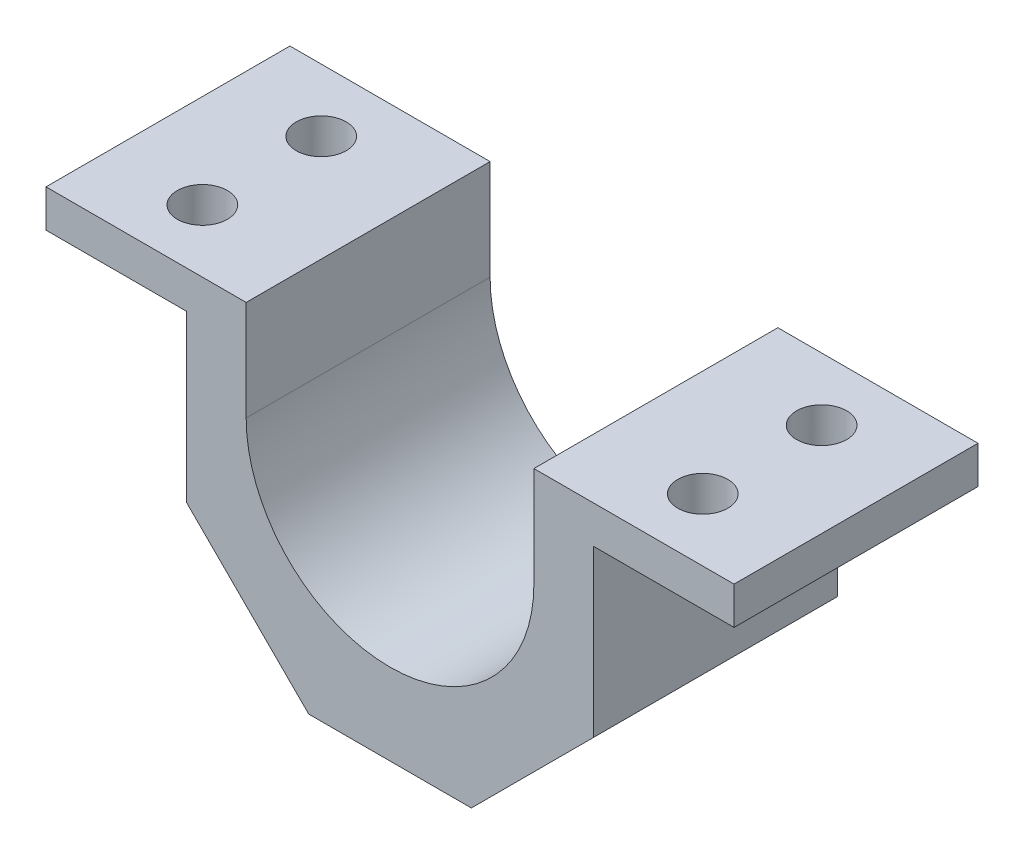
ISO-10303-21;
HEADER;
FILE_DESCRIPTION(('STEP AP214'),'2;1');
FILE_NAME('part.step','',(''),(''),'','','');
FILE_SCHEMA(('AUTOMOTIVE_DESIGN { 1 0 10303 214 1 1 1 1 }'));
ENDSEC;
DATA;
#1=APPLICATION_CONTEXT('core data for automotive mechanical design processes');
#2=APPLICATION_PROTOCOL_DEFINITION('international standard','automotive_design',2000,#1);
#3=PRODUCT_CONTEXT('',#1,'mechanical');
#4=PRODUCT('Part','Part','',(#3));
#5=PRODUCT_RELATED_PRODUCT_CATEGORY('part','',(#4));
#6=PRODUCT_DEFINITION_FORMATION('','',#4);
#7=PRODUCT_DEFINITION_CONTEXT('part definition',#1,'design');
#8=PRODUCT_DEFINITION('design','',#6,#7);
#9=PRODUCT_DEFINITION_SHAPE('','',#8);
#10=(LENGTH_UNIT() NAMED_UNIT(*) SI_UNIT(.MILLI.,.METRE.));
#11=(NAMED_UNIT(*) PLANE_ANGLE_UNIT() SI_UNIT($,.RADIAN.));
#12=(NAMED_UNIT(*) SI_UNIT($,.STERADIAN.) SOLID_ANGLE_UNIT());
#13=UNCERTAINTY_MEASURE_WITH_UNIT(LENGTH_MEASURE(1.E-05),#10,'distance_accuracy_value','');
#14=(GEOMETRIC_REPRESENTATION_CONTEXT(3) GLOBAL_UNCERTAINTY_ASSIGNED_CONTEXT((#13)) GLOBAL_UNIT_ASSIGNED_CONTEXT((#10,
#11,#12)) REPRESENTATION_CONTEXT('',''));
#15=CARTESIAN_POINT('',(0.,0.,0.));
#16=DIRECTION('',(0.,0.,1.));
#17=DIRECTION('',(1.,0.,0.));
#18=AXIS2_PLACEMENT_3D('',#15,#16,#17);
#19=CARTESIAN_POINT('',(0.,0.,19.5));
#20=DIRECTION('',(0.,0.,-1.));
#21=DIRECTION('',(-1.,0.,0.));
#22=AXIS2_PLACEMENT_3D('',#19,#20,#21);
#23=CYLINDRICAL_SURFACE('',#22,23.);
#24=CARTESIAN_POINT('',(0.,0.,-19.5));
#25=DIRECTION('',(0.,0.,-1.));
#26=DIRECTION('',(1.,0.,0.));
#27=AXIS2_PLACEMENT_3D('',#24,#25,#26);
#28=CIRCLE('',#27,23.);
#29=CARTESIAN_POINT('',(23.,0.,-19.5));
#30=VERTEX_POINT('',#29);
#31=CARTESIAN_POINT('',(-23.,0.,-19.5));
#32=VERTEX_POINT('',#31);
#33=EDGE_CURVE('E172',#30,#32,#28,.T.);
#34=ORIENTED_EDGE('',*,*,#33,.T.);
#35=DIRECTION('',(0.,0.,-1.));
#36=VECTOR('',#35,1.);
#37=CARTESIAN_POINT('',(-23.,0.,19.5));
#38=LINE('',#37,#36);
#39=CARTESIAN_POINT('',(-23.,0.,19.5));
#40=VERTEX_POINT('',#39);
#41=EDGE_CURVE('E11',#40,#32,#38,.T.);
#42=ORIENTED_EDGE('',*,*,#41,.F.);
#43=CARTESIAN_POINT('',(0.,0.,19.5));
#44=DIRECTION('',(0.,0.,-1.));
#45=DIRECTION('',(1.,0.,0.));
#46=AXIS2_PLACEMENT_3D('',#43,#44,#45);
#47=CIRCLE('',#46,23.);
#48=CARTESIAN_POINT('',(23.,0.,19.5));
#49=VERTEX_POINT('',#48);
#50=EDGE_CURVE('E202',#49,#40,#47,.T.);
#51=ORIENTED_EDGE('',*,*,#50,.F.);
#52=DIRECTION('',(0.,0.,-1.));
#53=VECTOR('',#52,1.);
#54=CARTESIAN_POINT('',(23.,0.,19.5));
#55=LINE('',#54,#53);
#56=EDGE_CURVE('E173',#49,#30,#55,.T.);
#57=ORIENTED_EDGE('',*,*,#56,.T.);
#58=EDGE_LOOP('',(#34,#42,#51,#57));
#59=FACE_BOUND('',#58,.T.);
#60=ADVANCED_FACE('F41',(#59),#23,.F.);
#61=CARTESIAN_POINT('',(-23.,0.,19.5));
#62=DIRECTION('',(-1.,0.,0.));
#63=DIRECTION('',(0.,0.,1.));
#64=AXIS2_PLACEMENT_3D('',#61,#62,#63);
#65=PLANE('',#64);
#66=DIRECTION('',(0.,1.,0.));
#67=VECTOR('',#66,1.);
#68=CARTESIAN_POINT('',(-23.,0.,-19.5));
#69=LINE('',#68,#67);
#70=CARTESIAN_POINT('',(-23.,16.,-19.5));
#71=VERTEX_POINT('',#70);
#72=EDGE_CURVE('E178',#32,#71,#69,.T.);
#73=ORIENTED_EDGE('',*,*,#72,.T.);
#74=DIRECTION('',(0.,0.,-1.));
#75=VECTOR('',#74,1.);
#76=CARTESIAN_POINT('',(-23.,16.,19.5));
#77=LINE('',#76,#75);
#78=CARTESIAN_POINT('',(-23.,16.,19.5));
#79=VERTEX_POINT('',#78);
#80=EDGE_CURVE('E49',#79,#71,#77,.T.);
#81=ORIENTED_EDGE('',*,*,#80,.F.);
#82=DIRECTION('',(0.,1.,0.));
#83=VECTOR('',#82,1.);
#84=CARTESIAN_POINT('',(-23.,0.,19.5));
#85=LINE('',#84,#83);
#86=EDGE_CURVE('E116',#40,#79,#85,.T.);
#87=ORIENTED_EDGE('',*,*,#86,.F.);
#88=ORIENTED_EDGE('',*,*,#41,.T.);
#89=EDGE_LOOP('',(#73,#81,#87,#88));
#90=FACE_BOUND('',#89,.T.);
#91=ADVANCED_FACE('F291',(#90),#65,.F.);
#92=CARTESIAN_POINT('',(-23.,16.,19.5));
#93=DIRECTION('',(0.,-1.,0.));
#94=DIRECTION('',(0.,0.,-1.));
#95=AXIS2_PLACEMENT_3D('',#92,#93,#94);
#96=PLANE('',#95);
#97=CARTESIAN_POINT('',(-40.,16.,-9.5));
#98=DIRECTION('',(0.,1.,0.));
#99=DIRECTION('',(0.,0.,-1.));
#100=AXIS2_PLACEMENT_3D('',#97,#98,#99);
#101=CIRCLE('',#100,4.00000000000001);
#102=CARTESIAN_POINT('',(-40.,16.,-13.5));
#103=VERTEX_POINT('',#102);
#104=EDGE_CURVE('E460',#103,#103,#101,.T.);
#105=ORIENTED_EDGE('',*,*,#104,.F.);
#106=EDGE_LOOP('',(#105));
#107=FACE_BOUND('',#106,.T.);
#108=CARTESIAN_POINT('',(-40.,16.,9.5));
#109=DIRECTION('',(0.,1.,0.));
#110=DIRECTION('',(0.,0.,1.));
#111=AXIS2_PLACEMENT_3D('',#108,#109,#110);
#112=CIRCLE('',#111,4.00000000000001);
#113=CARTESIAN_POINT('',(-40.,16.,13.5));
#114=VERTEX_POINT('',#113);
#115=EDGE_CURVE('E245',#114,#114,#112,.T.);
#116=ORIENTED_EDGE('',*,*,#115,.F.);
#117=EDGE_LOOP('',(#116));
#118=FACE_BOUND('',#117,.T.);
#119=DIRECTION('',(-1.,0.,0.));
#120=VECTOR('',#119,1.);
#121=CARTESIAN_POINT('',(-23.,16.,-19.5));
#122=LINE('',#121,#120);
#123=CARTESIAN_POINT('',(-55.,16.,-19.5));
#124=VERTEX_POINT('',#123);
#125=EDGE_CURVE('E179',#71,#124,#122,.T.);
#126=ORIENTED_EDGE('',*,*,#125,.T.);
#127=DIRECTION('',(0.,0.,-1.));
#128=VECTOR('',#127,1.);
#129=CARTESIAN_POINT('',(-55.,16.,19.5));
#130=LINE('',#129,#128);
#131=CARTESIAN_POINT('',(-55.,16.,19.5));
#132=VERTEX_POINT('',#131);
#133=EDGE_CURVE('E226',#132,#124,#130,.T.);
#134=ORIENTED_EDGE('',*,*,#133,.F.);
#135=DIRECTION('',(-1.,0.,0.));
#136=VECTOR('',#135,1.);
#137=CARTESIAN_POINT('',(-23.,16.,19.5));
#138=LINE('',#137,#136);
#139=EDGE_CURVE('E246',#79,#132,#138,.T.);
#140=ORIENTED_EDGE('',*,*,#139,.F.);
#141=ORIENTED_EDGE('',*,*,#80,.T.);
#142=EDGE_LOOP('',(#126,#134,#140,#141));
#143=FACE_BOUND('',#142,.T.);
#144=ADVANCED_FACE('F300',(#107,#118,#143),#96,.F.);
#145=CARTESIAN_POINT('',(-55.,16.,19.5));
#146=DIRECTION('',(1.,0.,0.));
#147=DIRECTION('',(0.,1.,0.));
#148=AXIS2_PLACEMENT_3D('',#145,#146,#147);
#149=PLANE('',#148);
#150=DIRECTION('',(0.,-1.,0.));
#151=VECTOR('',#150,1.);
#152=CARTESIAN_POINT('',(-55.,16.,-19.5));
#153=LINE('',#152,#151);
#154=CARTESIAN_POINT('',(-55.,10.,-19.5));
#155=VERTEX_POINT('',#154);
#156=EDGE_CURVE('E185',#124,#155,#153,.T.);
#157=ORIENTED_EDGE('',*,*,#156,.T.);
#158=DIRECTION('',(0.,0.,-1.));
#159=VECTOR('',#158,1.);
#160=CARTESIAN_POINT('',(-55.,10.,19.5));
#161=LINE('',#160,#159);
#162=CARTESIAN_POINT('',(-55.,10.,19.5));
#163=VERTEX_POINT('',#162);
#164=EDGE_CURVE('E223',#163,#155,#161,.T.);
#165=ORIENTED_EDGE('',*,*,#164,.F.);
#166=DIRECTION('',(0.,-1.,0.));
#167=VECTOR('',#166,1.);
#168=CARTESIAN_POINT('',(-55.,16.,19.5));
#169=LINE('',#168,#167);
#170=EDGE_CURVE('E248',#132,#163,#169,.T.);
#171=ORIENTED_EDGE('',*,*,#170,.F.);
#172=ORIENTED_EDGE('',*,*,#133,.T.);
#173=EDGE_LOOP('',(#157,#165,#171,#172));
#174=FACE_BOUND('',#173,.T.);
#175=ADVANCED_FACE('F302',(#174),#149,.F.);
#176=CARTESIAN_POINT('',(-55.,10.,19.5));
#177=DIRECTION('',(0.,1.,0.));
#178=DIRECTION('',(-1.,0.,0.));
#179=AXIS2_PLACEMENT_3D('',#176,#177,#178);
#180=PLANE('',#179);
#181=CARTESIAN_POINT('',(-40.,9.99999999999999,-9.5));
#182=DIRECTION('',(0.,1.,0.));
#183=DIRECTION('',(-1.,0.,0.));
#184=AXIS2_PLACEMENT_3D('',#181,#182,#183);
#185=CIRCLE('',#184,4.00000000000001);
#186=CARTESIAN_POINT('',(-44.,10.,-9.5));
#187=VERTEX_POINT('',#186);
#188=EDGE_CURVE('E42',#187,#187,#185,.T.);
#189=ORIENTED_EDGE('',*,*,#188,.T.);
#190=EDGE_LOOP('',(#189));
#191=FACE_BOUND('',#190,.T.);
#192=CARTESIAN_POINT('',(-40.,9.99999999999999,9.5));
#193=DIRECTION('',(0.,1.,0.));
#194=DIRECTION('',(-1.,0.,0.));
#195=AXIS2_PLACEMENT_3D('',#192,#193,#194);
#196=CIRCLE('',#195,4.00000000000001);
#197=CARTESIAN_POINT('',(-44.,10.,9.5));
#198=VERTEX_POINT('',#197);
#199=EDGE_CURVE('E229',#198,#198,#196,.T.);
#200=ORIENTED_EDGE('',*,*,#199,.T.);
#201=EDGE_LOOP('',(#200));
#202=FACE_BOUND('',#201,.T.);
#203=DIRECTION('',(1.,0.,0.));
#204=VECTOR('',#203,1.);
#205=CARTESIAN_POINT('',(-55.,10.,-19.5));
#206=LINE('',#205,#204);
#207=CARTESIAN_POINT('',(-32.5,9.99999999999999,-19.5));
#208=VERTEX_POINT('',#207);
#209=EDGE_CURVE('E182',#155,#208,#206,.T.);
#210=ORIENTED_EDGE('',*,*,#209,.T.);
#211=DIRECTION('',(0.,0.,-1.));
#212=VECTOR('',#211,1.);
#213=CARTESIAN_POINT('',(-32.5,9.99999999999999,19.5));
#214=LINE('',#213,#212);
#215=CARTESIAN_POINT('',(-32.5,9.99999999999999,19.5));
#216=VERTEX_POINT('',#215);
#217=EDGE_CURVE('E217',#216,#208,#214,.T.);
#218=ORIENTED_EDGE('',*,*,#217,.F.);
#219=DIRECTION('',(1.,0.,0.));
#220=VECTOR('',#219,1.);
#221=CARTESIAN_POINT('',(-55.,10.,19.5));
#222=LINE('',#221,#220);
#223=EDGE_CURVE('E255',#163,#216,#222,.T.);
#224=ORIENTED_EDGE('',*,*,#223,.F.);
#225=ORIENTED_EDGE('',*,*,#164,.T.);
#226=EDGE_LOOP('',(#210,#218,#224,#225));
#227=FACE_BOUND('',#226,.T.);
#228=ADVANCED_FACE('F310',(#191,#202,#227),#180,.F.);
#229=CARTESIAN_POINT('',(-32.5,9.99999999999999,19.5));
#230=DIRECTION('',(1.,0.,0.));
#231=DIRECTION('',(0.,1.,0.));
#232=AXIS2_PLACEMENT_3D('',#229,#230,#231);
#233=PLANE('',#232);
#234=DIRECTION('',(0.,-1.,0.));
#235=VECTOR('',#234,1.);
#236=CARTESIAN_POINT('',(-32.5,9.99999999999999,-19.5));
#237=LINE('',#236,#235);
#238=CARTESIAN_POINT('',(-32.5,-16.499999999999,-19.5));
#239=VERTEX_POINT('',#238);
#240=EDGE_CURVE('E186',#208,#239,#237,.T.);
#241=ORIENTED_EDGE('',*,*,#240,.T.);
#242=DIRECTION('',(0.,0.,-1.));
#243=VECTOR('',#242,1.);
#244=CARTESIAN_POINT('',(-32.5,-16.499999999999,19.5));
#245=LINE('',#244,#243);
#246=CARTESIAN_POINT('',(-32.5,-16.499999999999,19.5));
#247=VERTEX_POINT('',#246);
#248=EDGE_CURVE('E220',#247,#239,#245,.T.);
#249=ORIENTED_EDGE('',*,*,#248,.F.);
#250=DIRECTION('',(0.,-1.,0.));
#251=VECTOR('',#250,1.);
#252=CARTESIAN_POINT('',(-32.5,9.99999999999999,19.5));
#253=LINE('',#252,#251);
#254=EDGE_CURVE('E254',#216,#247,#253,.T.);
#255=ORIENTED_EDGE('',*,*,#254,.F.);
#256=ORIENTED_EDGE('',*,*,#217,.T.);
#257=EDGE_LOOP('',(#241,#249,#255,#256));
#258=FACE_BOUND('',#257,.T.);
#259=ADVANCED_FACE('F311',(#258),#233,.F.);
#260=CARTESIAN_POINT('',(-32.5,-16.499999999999,19.5));
#261=DIRECTION('',(0.707106781186565,0.70710678118653,0.));
#262=DIRECTION('',(-0.70710678118653,0.707106781186565,0.));
#263=AXIS2_PLACEMENT_3D('',#260,#261,#262);
#264=PLANE('',#263);
#265=DIRECTION('',(0.70710678118653,-0.707106781186565,0.));
#266=VECTOR('',#265,1.);
#267=CARTESIAN_POINT('',(-32.5,-16.499999999999,-19.5));
#268=LINE('',#267,#266);
#269=CARTESIAN_POINT('',(-13.,-36.,-19.5));
#270=VERTEX_POINT('',#269);
#271=EDGE_CURVE('E187',#239,#270,#268,.T.);
#272=ORIENTED_EDGE('',*,*,#271,.T.);
#273=DIRECTION('',(0.,0.,-1.));
#274=VECTOR('',#273,1.);
#275=CARTESIAN_POINT('',(-13.,-36.,19.5));
#276=LINE('',#275,#274);
#277=CARTESIAN_POINT('',(-13.,-36.,19.5));
#278=VERTEX_POINT('',#277);
#279=EDGE_CURVE('E215',#278,#270,#276,.T.);
#280=ORIENTED_EDGE('',*,*,#279,.F.);
#281=DIRECTION('',(0.70710678118653,-0.707106781186565,0.));
#282=VECTOR('',#281,1.);
#283=CARTESIAN_POINT('',(-32.5,-16.499999999999,19.5));
#284=LINE('',#283,#282);
#285=EDGE_CURVE('E258',#247,#278,#284,.T.);
#286=ORIENTED_EDGE('',*,*,#285,.F.);
#287=ORIENTED_EDGE('',*,*,#248,.T.);
#288=EDGE_LOOP('',(#272,#280,#286,#287));
#289=FACE_BOUND('',#288,.T.);
#290=ADVANCED_FACE('F314',(#289),#264,.F.);
#291=CARTESIAN_POINT('',(13.,-36.,19.5));
#292=DIRECTION('',(0.,1.,0.));
#293=DIRECTION('',(-1.,0.,0.));
#294=AXIS2_PLACEMENT_3D('',#291,#292,#293);
#295=PLANE('',#294);
#296=DIRECTION('',(1.,0.,0.));
#297=VECTOR('',#296,1.);
#298=CARTESIAN_POINT('',(13.,-36.,-19.5));
#299=LINE('',#298,#297);
#300=CARTESIAN_POINT('',(13.,-36.,-19.5));
#301=VERTEX_POINT('',#300);
#302=EDGE_CURVE('E189',#270,#301,#299,.T.);
#303=ORIENTED_EDGE('',*,*,#302,.T.);
#304=DIRECTION('',(0.,0.,-1.));
#305=VECTOR('',#304,1.);
#306=CARTESIAN_POINT('',(13.,-36.,19.5));
#307=LINE('',#306,#305);
#308=CARTESIAN_POINT('',(13.,-36.,19.5));
#309=VERTEX_POINT('',#308);
#310=EDGE_CURVE('E213',#309,#301,#307,.T.);
#311=ORIENTED_EDGE('',*,*,#310,.F.);
#312=DIRECTION('',(1.,0.,0.));
#313=VECTOR('',#312,1.);
#314=CARTESIAN_POINT('',(13.,-36.,19.5));
#315=LINE('',#314,#313);
#316=EDGE_CURVE('E256',#278,#309,#315,.T.);
#317=ORIENTED_EDGE('',*,*,#316,.F.);
#318=ORIENTED_EDGE('',*,*,#279,.T.);
#319=EDGE_LOOP('',(#303,#311,#317,#318));
#320=FACE_BOUND('',#319,.T.);
#321=ADVANCED_FACE('F317',(#320),#295,.F.);
#322=CARTESIAN_POINT('',(32.5,-16.499999999999,19.5));
#323=DIRECTION('',(-0.707106781186566,0.70710678118653,0.));
#324=DIRECTION('',(-0.70710678118653,-0.707106781186565,0.));
#325=AXIS2_PLACEMENT_3D('',#322,#323,#324);
#326=PLANE('',#325);
#327=DIRECTION('',(0.70710678118653,0.707106781186566,0.));
#328=VECTOR('',#327,1.);
#329=CARTESIAN_POINT('',(32.5,-16.499999999999,-19.5));
#330=LINE('',#329,#328);
#331=CARTESIAN_POINT('',(32.5,-16.499999999999,-19.5));
#332=VERTEX_POINT('',#331);
#333=EDGE_CURVE('E195',#301,#332,#330,.T.);
#334=ORIENTED_EDGE('',*,*,#333,.T.);
#335=DIRECTION('',(0.,0.,-1.));
#336=VECTOR('',#335,1.);
#337=CARTESIAN_POINT('',(32.5,-16.499999999999,19.5));
#338=LINE('',#337,#336);
#339=CARTESIAN_POINT('',(32.5,-16.499999999999,19.5));
#340=VERTEX_POINT('',#339);
#341=EDGE_CURVE('E208',#340,#332,#338,.T.);
#342=ORIENTED_EDGE('',*,*,#341,.F.);
#343=DIRECTION('',(0.70710678118653,0.707106781186566,0.));
#344=VECTOR('',#343,1.);
#345=CARTESIAN_POINT('',(32.5,-16.499999999999,19.5));
#346=LINE('',#345,#344);
#347=EDGE_CURVE('E259',#309,#340,#346,.T.);
#348=ORIENTED_EDGE('',*,*,#347,.F.);
#349=ORIENTED_EDGE('',*,*,#310,.T.);
#350=EDGE_LOOP('',(#334,#342,#348,#349));
#351=FACE_BOUND('',#350,.T.);
#352=ADVANCED_FACE('F322',(#351),#326,.F.);
#353=CARTESIAN_POINT('',(32.5,9.99999999999999,19.5));
#354=DIRECTION('',(-1.,0.,0.));
#355=DIRECTION('',(0.,-1.,0.));
#356=AXIS2_PLACEMENT_3D('',#353,#354,#355);
#357=PLANE('',#356);
#358=DIRECTION('',(0.,1.,0.));
#359=VECTOR('',#358,1.);
#360=CARTESIAN_POINT('',(32.5,9.99999999999999,-19.5));
#361=LINE('',#360,#359);
#362=CARTESIAN_POINT('',(32.5,9.99999999999999,-19.5));
#363=VERTEX_POINT('',#362);
#364=EDGE_CURVE('E191',#332,#363,#361,.T.);
#365=ORIENTED_EDGE('',*,*,#364,.T.);
#366=DIRECTION('',(0.,0.,-1.));
#367=VECTOR('',#366,1.);
#368=CARTESIAN_POINT('',(32.5,9.99999999999999,19.5));
#369=LINE('',#368,#367);
#370=CARTESIAN_POINT('',(32.5,9.99999999999999,19.5));
#371=VERTEX_POINT('',#370);
#372=EDGE_CURVE('E203',#371,#363,#369,.T.);
#373=ORIENTED_EDGE('',*,*,#372,.F.);
#374=DIRECTION('',(0.,1.,0.));
#375=VECTOR('',#374,1.);
#376=CARTESIAN_POINT('',(32.5,9.99999999999999,19.5));
#377=LINE('',#376,#375);
#378=EDGE_CURVE('E265',#340,#371,#377,.T.);
#379=ORIENTED_EDGE('',*,*,#378,.F.);
#380=ORIENTED_EDGE('',*,*,#341,.T.);
#381=EDGE_LOOP('',(#365,#373,#379,#380));
#382=FACE_BOUND('',#381,.T.);
#383=ADVANCED_FACE('F268',(#382),#357,.F.);
#384=CARTESIAN_POINT('',(55.,10.,19.5));
#385=DIRECTION('',(0.,1.,0.));
#386=DIRECTION('',(-1.,0.,0.));
#387=AXIS2_PLACEMENT_3D('',#384,#385,#386);
#388=PLANE('',#387);
#389=CARTESIAN_POINT('',(40.,9.99999999999999,9.5));
#390=DIRECTION('',(0.,1.,0.));
#391=DIRECTION('',(-1.,0.,0.));
#392=AXIS2_PLACEMENT_3D('',#389,#390,#391);
#393=CIRCLE('',#392,4.00000000000001);
#394=CARTESIAN_POINT('',(36.,9.99999999999999,9.5));
#395=VERTEX_POINT('',#394);
#396=EDGE_CURVE('E235',#395,#395,#393,.T.);
#397=ORIENTED_EDGE('',*,*,#396,.T.);
#398=EDGE_LOOP('',(#397));
#399=FACE_BOUND('',#398,.T.);
#400=CARTESIAN_POINT('',(40.,9.99999999999999,-9.5));
#401=DIRECTION('',(0.,1.,0.));
#402=DIRECTION('',(-1.,0.,0.));
#403=AXIS2_PLACEMENT_3D('',#400,#401,#402);
#404=CIRCLE('',#403,4.00000000000001);
#405=CARTESIAN_POINT('',(36.,9.99999999999999,-9.5));
#406=VERTEX_POINT('',#405);
#407=EDGE_CURVE('E240',#406,#406,#404,.T.);
#408=ORIENTED_EDGE('',*,*,#407,.T.);
#409=EDGE_LOOP('',(#408));
#410=FACE_BOUND('',#409,.T.);
#411=DIRECTION('',(1.,0.,0.));
#412=VECTOR('',#411,1.);
#413=CARTESIAN_POINT('',(55.,10.,-19.5));
#414=LINE('',#413,#412);
#415=CARTESIAN_POINT('',(55.,10.,-19.5));
#416=VERTEX_POINT('',#415);
#417=EDGE_CURVE('E197',#363,#416,#414,.T.);
#418=ORIENTED_EDGE('',*,*,#417,.T.);
#419=DIRECTION('',(0.,0.,-1.));
#420=VECTOR('',#419,1.);
#421=CARTESIAN_POINT('',(55.,10.,19.5));
#422=LINE('',#421,#420);
#423=CARTESIAN_POINT('',(55.,10.,19.5));
#424=VERTEX_POINT('',#423);
#425=EDGE_CURVE('E168',#424,#416,#422,.T.);
#426=ORIENTED_EDGE('',*,*,#425,.F.);
#427=DIRECTION('',(1.,0.,0.));
#428=VECTOR('',#427,1.);
#429=CARTESIAN_POINT('',(55.,10.,19.5));
#430=LINE('',#429,#428);
#431=EDGE_CURVE('E160',#371,#424,#430,.T.);
#432=ORIENTED_EDGE('',*,*,#431,.F.);
#433=ORIENTED_EDGE('',*,*,#372,.T.);
#434=EDGE_LOOP('',(#418,#426,#432,#433));
#435=FACE_BOUND('',#434,.T.);
#436=ADVANCED_FACE('F275',(#399,#410,#435),#388,.F.);
#437=CARTESIAN_POINT('',(55.,16.,19.5));
#438=DIRECTION('',(-1.,0.,0.));
#439=DIRECTION('',(0.,-1.,0.));
#440=AXIS2_PLACEMENT_3D('',#437,#438,#439);
#441=PLANE('',#440);
#442=DIRECTION('',(0.,1.,0.));
#443=VECTOR('',#442,1.);
#444=CARTESIAN_POINT('',(55.,16.,-19.5));
#445=LINE('',#444,#443);
#446=CARTESIAN_POINT('',(55.,16.,-19.5));
#447=VERTEX_POINT('',#446);
#448=EDGE_CURVE('E161',#416,#447,#445,.T.);
#449=ORIENTED_EDGE('',*,*,#448,.T.);
#450=DIRECTION('',(0.,0.,-1.));
#451=VECTOR('',#450,1.);
#452=CARTESIAN_POINT('',(55.,16.,19.5));
#453=LINE('',#452,#451);
#454=CARTESIAN_POINT('',(55.,16.,19.5));
#455=VERTEX_POINT('',#454);
#456=EDGE_CURVE('E165',#455,#447,#453,.T.);
#457=ORIENTED_EDGE('',*,*,#456,.F.);
#458=DIRECTION('',(0.,1.,0.));
#459=VECTOR('',#458,1.);
#460=CARTESIAN_POINT('',(55.,16.,19.5));
#461=LINE('',#460,#459);
#462=EDGE_CURVE('E152',#424,#455,#461,.T.);
#463=ORIENTED_EDGE('',*,*,#462,.F.);
#464=ORIENTED_EDGE('',*,*,#425,.T.);
#465=EDGE_LOOP('',(#449,#457,#463,#464));
#466=FACE_BOUND('',#465,.T.);
#467=ADVANCED_FACE('F163',(#466),#441,.F.);
#468=CARTESIAN_POINT('',(23.,16.,19.5));
#469=DIRECTION('',(0.,-1.,0.));
#470=DIRECTION('',(0.,0.,-1.));
#471=AXIS2_PLACEMENT_3D('',#468,#469,#470);
#472=PLANE('',#471);
#473=CARTESIAN_POINT('',(40.,16.,9.5));
#474=DIRECTION('',(0.,1.,0.));
#475=DIRECTION('',(0.,0.,-1.));
#476=AXIS2_PLACEMENT_3D('',#473,#474,#475);
#477=CIRCLE('',#476,4.00000000000001);
#478=CARTESIAN_POINT('',(40.,16.,5.5));
#479=VERTEX_POINT('',#478);
#480=EDGE_CURVE('E479',#479,#479,#477,.T.);
#481=ORIENTED_EDGE('',*,*,#480,.F.);
#482=EDGE_LOOP('',(#481));
#483=FACE_BOUND('',#482,.T.);
#484=CARTESIAN_POINT('',(40.,16.,-9.5));
#485=DIRECTION('',(0.,1.,0.));
#486=DIRECTION('',(0.,0.,1.));
#487=AXIS2_PLACEMENT_3D('',#484,#485,#486);
#488=CIRCLE('',#487,4.00000000000001);
#489=CARTESIAN_POINT('',(40.,16.,-5.49999999999999));
#490=VERTEX_POINT('',#489);
#491=EDGE_CURVE('E481',#490,#490,#488,.T.);
#492=ORIENTED_EDGE('',*,*,#491,.F.);
#493=EDGE_LOOP('',(#492));
#494=FACE_BOUND('',#493,.T.);
#495=DIRECTION('',(-1.,0.,0.));
#496=VECTOR('',#495,1.);
#497=CARTESIAN_POINT('',(23.,16.,-19.5));
#498=LINE('',#497,#496);
#499=CARTESIAN_POINT('',(23.,16.,-19.5));
#500=VERTEX_POINT('',#499);
#501=EDGE_CURVE('E107',#447,#500,#498,.T.);
#502=ORIENTED_EDGE('',*,*,#501,.T.);
#503=DIRECTION('',(0.,0.,-1.));
#504=VECTOR('',#503,1.);
#505=CARTESIAN_POINT('',(23.,16.,19.5));
#506=LINE('',#505,#504);
#507=CARTESIAN_POINT('',(23.,16.,19.5));
#508=VERTEX_POINT('',#507);
#509=EDGE_CURVE('E167',#508,#500,#506,.T.);
#510=ORIENTED_EDGE('',*,*,#509,.F.);
#511=DIRECTION('',(-1.,0.,0.));
#512=VECTOR('',#511,1.);
#513=CARTESIAN_POINT('',(23.,16.,19.5));
#514=LINE('',#513,#512);
#515=EDGE_CURVE('E151',#455,#508,#514,.T.);
#516=ORIENTED_EDGE('',*,*,#515,.F.);
#517=ORIENTED_EDGE('',*,*,#456,.T.);
#518=EDGE_LOOP('',(#502,#510,#516,#517));
#519=FACE_BOUND('',#518,.T.);
#520=ADVANCED_FACE('F170',(#483,#494,#519),#472,.F.);
#521=CARTESIAN_POINT('',(23.,0.,19.5));
#522=DIRECTION('',(1.,0.,0.));
#523=DIRECTION('',(0.,0.,-1.));
#524=AXIS2_PLACEMENT_3D('',#521,#522,#523);
#525=PLANE('',#524);
#526=DIRECTION('',(0.,-1.,0.));
#527=VECTOR('',#526,1.);
#528=CARTESIAN_POINT('',(23.,0.,-19.5));
#529=LINE('',#528,#527);
#530=EDGE_CURVE('E115',#500,#30,#529,.T.);
#531=ORIENTED_EDGE('',*,*,#530,.T.);
#532=ORIENTED_EDGE('',*,*,#56,.F.);
#533=DIRECTION('',(0.,-1.,0.));
#534=VECTOR('',#533,1.);
#535=CARTESIAN_POINT('',(23.,0.,19.5));
#536=LINE('',#535,#534);
#537=EDGE_CURVE('E56',#508,#49,#536,.T.);
#538=ORIENTED_EDGE('',*,*,#537,.F.);
#539=ORIENTED_EDGE('',*,*,#509,.T.);
#540=EDGE_LOOP('',(#531,#532,#538,#539));
#541=FACE_BOUND('',#540,.T.);
#542=ADVANCED_FACE('F279',(#541),#525,.F.);
#543=CARTESIAN_POINT('',(0.,0.,19.5));
#544=DIRECTION('',(0.,0.,1.));
#545=DIRECTION('',(1.,0.,0.));
#546=AXIS2_PLACEMENT_3D('',#543,#544,#545);
#547=PLANE('',#546);
#548=ORIENTED_EDGE('',*,*,#50,.T.);
#549=ORIENTED_EDGE('',*,*,#86,.T.);
#550=ORIENTED_EDGE('',*,*,#139,.T.);
#551=ORIENTED_EDGE('',*,*,#170,.T.);
#552=ORIENTED_EDGE('',*,*,#223,.T.);
#553=ORIENTED_EDGE('',*,*,#254,.T.);
#554=ORIENTED_EDGE('',*,*,#285,.T.);
#555=ORIENTED_EDGE('',*,*,#316,.T.);
#556=ORIENTED_EDGE('',*,*,#347,.T.);
#557=ORIENTED_EDGE('',*,*,#378,.T.);
#558=ORIENTED_EDGE('',*,*,#431,.T.);
#559=ORIENTED_EDGE('',*,*,#462,.T.);
#560=ORIENTED_EDGE('',*,*,#515,.T.);
#561=ORIENTED_EDGE('',*,*,#537,.T.);
#562=EDGE_LOOP('',(#548,#549,#550,#551,#552,#553,#554,#555,#556,#557,#558,#559,#560,#561));
#563=FACE_BOUND('',#562,.T.);
#564=ADVANCED_FACE('F153',(#563),#547,.T.);
#565=CARTESIAN_POINT('',(0.,0.,-19.5));
#566=DIRECTION('',(0.,0.,1.));
#567=DIRECTION('',(1.,0.,0.));
#568=AXIS2_PLACEMENT_3D('',#565,#566,#567);
#569=PLANE('',#568);
#570=ORIENTED_EDGE('',*,*,#33,.F.);
#571=ORIENTED_EDGE('',*,*,#530,.F.);
#572=ORIENTED_EDGE('',*,*,#501,.F.);
#573=ORIENTED_EDGE('',*,*,#448,.F.);
#574=ORIENTED_EDGE('',*,*,#417,.F.);
#575=ORIENTED_EDGE('',*,*,#364,.F.);
#576=ORIENTED_EDGE('',*,*,#333,.F.);
#577=ORIENTED_EDGE('',*,*,#302,.F.);
#578=ORIENTED_EDGE('',*,*,#271,.F.);
#579=ORIENTED_EDGE('',*,*,#240,.F.);
#580=ORIENTED_EDGE('',*,*,#209,.F.);
#581=ORIENTED_EDGE('',*,*,#156,.F.);
#582=ORIENTED_EDGE('',*,*,#125,.F.);
#583=ORIENTED_EDGE('',*,*,#72,.F.);
#584=EDGE_LOOP('',(#570,#571,#572,#573,#574,#575,#576,#577,#578,#579,#580,#581,#582,#583));
#585=FACE_BOUND('',#584,.T.);
#586=ADVANCED_FACE('F274',(#585),#569,.F.);
#587=CARTESIAN_POINT('',(40.,-36.,-9.5));
#588=DIRECTION('',(0.,1.,0.));
#589=DIRECTION('',(0.,0.,1.));
#590=AXIS2_PLACEMENT_3D('',#587,#588,#589);
#591=CYLINDRICAL_SURFACE('',#590,4.00000000000001);
#592=ORIENTED_EDGE('',*,*,#491,.T.);
#593=EDGE_LOOP('',(#592));
#594=FACE_BOUND('',#593,.T.);
#595=ORIENTED_EDGE('',*,*,#407,.F.);
#596=EDGE_LOOP('',(#595));
#597=FACE_BOUND('',#596,.T.);
#598=ADVANCED_FACE('F393',(#594,#597),#591,.F.);
#599=CARTESIAN_POINT('',(40.,-36.,9.5));
#600=DIRECTION('',(0.,1.,0.));
#601=DIRECTION('',(0.,0.,1.));
#602=AXIS2_PLACEMENT_3D('',#599,#600,#601);
#603=CYLINDRICAL_SURFACE('',#602,4.00000000000001);
#604=ORIENTED_EDGE('',*,*,#480,.T.);
#605=EDGE_LOOP('',(#604));
#606=FACE_BOUND('',#605,.T.);
#607=ORIENTED_EDGE('',*,*,#396,.F.);
#608=EDGE_LOOP('',(#607));
#609=FACE_BOUND('',#608,.T.);
#610=ADVANCED_FACE('F394',(#606,#609),#603,.F.);
#611=CARTESIAN_POINT('',(-40.,-36.,9.5));
#612=DIRECTION('',(0.,1.,0.));
#613=DIRECTION('',(0.,0.,1.));
#614=AXIS2_PLACEMENT_3D('',#611,#612,#613);
#615=CYLINDRICAL_SURFACE('',#614,4.00000000000001);
#616=ORIENTED_EDGE('',*,*,#115,.T.);
#617=EDGE_LOOP('',(#616));
#618=FACE_BOUND('',#617,.T.);
#619=ORIENTED_EDGE('',*,*,#199,.F.);
#620=EDGE_LOOP('',(#619));
#621=FACE_BOUND('',#620,.T.);
#622=ADVANCED_FACE('F404',(#618,#621),#615,.F.);
#623=CARTESIAN_POINT('',(-40.,-36.,-9.5));
#624=DIRECTION('',(0.,1.,0.));
#625=DIRECTION('',(0.,0.,1.));
#626=AXIS2_PLACEMENT_3D('',#623,#624,#625);
#627=CYLINDRICAL_SURFACE('',#626,4.00000000000001);
#628=ORIENTED_EDGE('',*,*,#104,.T.);
#629=EDGE_LOOP('',(#628));
#630=FACE_BOUND('',#629,.T.);
#631=ORIENTED_EDGE('',*,*,#188,.F.);
#632=EDGE_LOOP('',(#631));
#633=FACE_BOUND('',#632,.T.);
#634=ADVANCED_FACE('F413',(#630,#633),#627,.F.);
#635=CLOSED_SHELL('',(#60,#91,#144,#175,#228,#259,#290,#321,#352,#383,#436,#467,#520,#542,#564,
#586,#598,#610,#622,#634));
#636=MANIFOLD_SOLID_BREP('B2',#635);
#637=ADVANCED_BREP_SHAPE_REPRESENTATION('',(#18,#636),#14);
#638=SHAPE_DEFINITION_REPRESENTATION(#9,#637);
ENDSEC;
END-ISO-10303-21;
